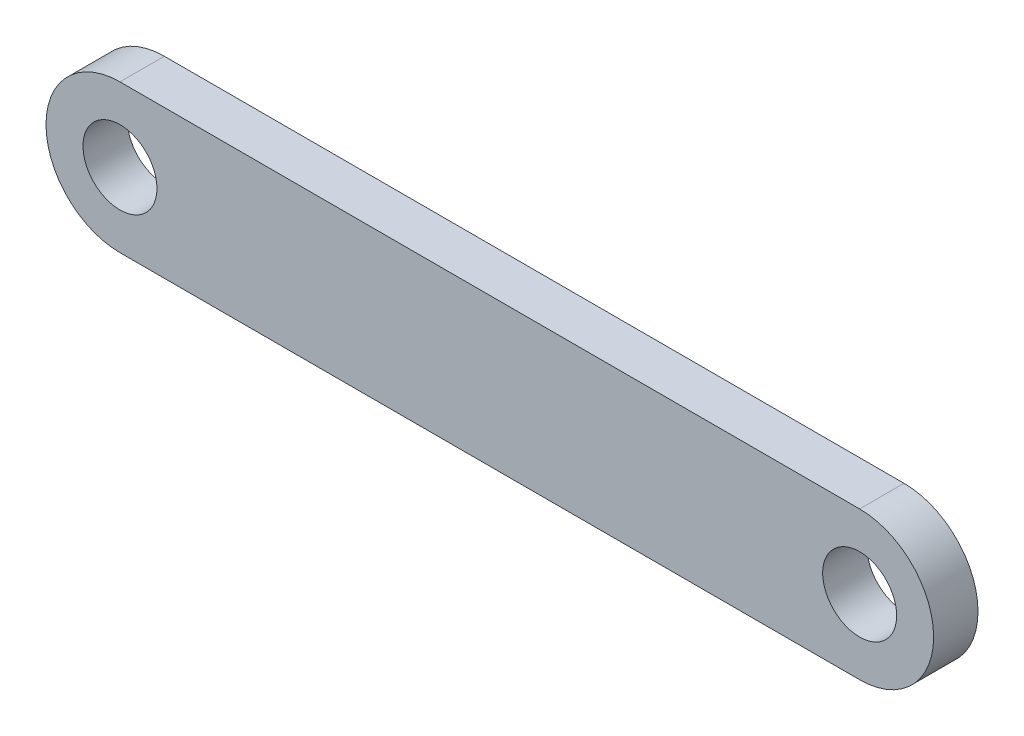
ISO-10303-21;
HEADER;
FILE_DESCRIPTION(('STEP AP214'),'2;1');
FILE_NAME('part.step','',(''),(''),'','','');
FILE_SCHEMA(('AUTOMOTIVE_DESIGN { 1 0 10303 214 1 1 1 1 }'));
ENDSEC;
DATA;
#1=APPLICATION_CONTEXT('core data for automotive mechanical design processes');
#2=APPLICATION_PROTOCOL_DEFINITION('international standard','automotive_design',2000,#1);
#3=PRODUCT_CONTEXT('',#1,'mechanical');
#4=PRODUCT('Part','Part','',(#3));
#5=PRODUCT_RELATED_PRODUCT_CATEGORY('part','',(#4));
#6=PRODUCT_DEFINITION_FORMATION('','',#4);
#7=PRODUCT_DEFINITION_CONTEXT('part definition',#1,'design');
#8=PRODUCT_DEFINITION('design','',#6,#7);
#9=PRODUCT_DEFINITION_SHAPE('','',#8);
#10=(LENGTH_UNIT() NAMED_UNIT(*) SI_UNIT(.MILLI.,.METRE.));
#11=(NAMED_UNIT(*) PLANE_ANGLE_UNIT() SI_UNIT($,.RADIAN.));
#12=(NAMED_UNIT(*) SI_UNIT($,.STERADIAN.) SOLID_ANGLE_UNIT());
#13=UNCERTAINTY_MEASURE_WITH_UNIT(LENGTH_MEASURE(1.E-05),#10,'distance_accuracy_value','');
#14=(GEOMETRIC_REPRESENTATION_CONTEXT(3) GLOBAL_UNCERTAINTY_ASSIGNED_CONTEXT((#13)) GLOBAL_UNIT_ASSIGNED_CONTEXT((#10,
#11,#12)) REPRESENTATION_CONTEXT('',''));
#15=CARTESIAN_POINT('',(0.,0.,0.));
#16=DIRECTION('',(0.,0.,1.));
#17=DIRECTION('',(1.,0.,0.));
#18=AXIS2_PLACEMENT_3D('',#15,#16,#17);
#19=CARTESIAN_POINT('',(-25.,0.,1.5));
#20=DIRECTION('',(0.,0.,-1.));
#21=DIRECTION('',(-1.,0.,0.));
#22=AXIS2_PLACEMENT_3D('',#19,#20,#21);
#23=CYLINDRICAL_SURFACE('',#22,5.);
#24=CARTESIAN_POINT('',(-25.,0.,-1.5));
#25=DIRECTION('',(0.,0.,1.));
#26=DIRECTION('',(1.,0.,0.));
#27=AXIS2_PLACEMENT_3D('',#24,#25,#26);
#28=CIRCLE('',#27,5.);
#29=CARTESIAN_POINT('',(-25.,5.,-1.5));
#30=VERTEX_POINT('',#29);
#31=CARTESIAN_POINT('',(-25.,-5.,-1.5));
#32=VERTEX_POINT('',#31);
#33=EDGE_CURVE('E108',#30,#32,#28,.T.);
#34=ORIENTED_EDGE('',*,*,#33,.T.);
#35=DIRECTION('',(0.,0.,-1.));
#36=VECTOR('',#35,1.);
#37=CARTESIAN_POINT('',(-25.,-5.,1.5));
#38=LINE('',#37,#36);
#39=CARTESIAN_POINT('',(-25.,-5.,1.5));
#40=VERTEX_POINT('',#39);
#41=EDGE_CURVE('E11',#40,#32,#38,.T.);
#42=ORIENTED_EDGE('',*,*,#41,.F.);
#43=CARTESIAN_POINT('',(-25.,0.,1.5));
#44=DIRECTION('',(0.,0.,1.));
#45=DIRECTION('',(1.,0.,0.));
#46=AXIS2_PLACEMENT_3D('',#43,#44,#45);
#47=CIRCLE('',#46,5.);
#48=CARTESIAN_POINT('',(-25.,5.,1.5));
#49=VERTEX_POINT('',#48);
#50=EDGE_CURVE('E96',#49,#40,#47,.T.);
#51=ORIENTED_EDGE('',*,*,#50,.F.);
#52=DIRECTION('',(0.,0.,-1.));
#53=VECTOR('',#52,1.);
#54=CARTESIAN_POINT('',(-25.,5.,1.5));
#55=LINE('',#54,#53);
#56=EDGE_CURVE('E101',#49,#30,#55,.T.);
#57=ORIENTED_EDGE('',*,*,#56,.T.);
#58=EDGE_LOOP('',(#34,#42,#51,#57));
#59=FACE_BOUND('',#58,.T.);
#60=ADVANCED_FACE('F44',(#59),#23,.T.);
#61=CARTESIAN_POINT('',(-25.,-5.,1.5));
#62=DIRECTION('',(0.,1.,0.));
#63=DIRECTION('',(-1.,0.,0.));
#64=AXIS2_PLACEMENT_3D('',#61,#62,#63);
#65=PLANE('',#64);
#66=DIRECTION('',(1.,0.,0.));
#67=VECTOR('',#66,1.);
#68=CARTESIAN_POINT('',(-25.,-5.,-1.5));
#69=LINE('',#68,#67);
#70=CARTESIAN_POINT('',(25.,-5.,-1.5));
#71=VERTEX_POINT('',#70);
#72=EDGE_CURVE('E99',#32,#71,#69,.T.);
#73=ORIENTED_EDGE('',*,*,#72,.T.);
#74=DIRECTION('',(0.,0.,-1.));
#75=VECTOR('',#74,1.);
#76=CARTESIAN_POINT('',(25.,-5.,1.5));
#77=LINE('',#76,#75);
#78=CARTESIAN_POINT('',(25.,-5.,1.5));
#79=VERTEX_POINT('',#78);
#80=EDGE_CURVE('E52',#79,#71,#77,.T.);
#81=ORIENTED_EDGE('',*,*,#80,.F.);
#82=DIRECTION('',(1.,0.,0.));
#83=VECTOR('',#82,1.);
#84=CARTESIAN_POINT('',(-25.,-5.,1.5));
#85=LINE('',#84,#83);
#86=EDGE_CURVE('E91',#40,#79,#85,.T.);
#87=ORIENTED_EDGE('',*,*,#86,.F.);
#88=ORIENTED_EDGE('',*,*,#41,.T.);
#89=EDGE_LOOP('',(#73,#81,#87,#88));
#90=FACE_BOUND('',#89,.T.);
#91=ADVANCED_FACE('F98',(#90),#65,.F.);
#92=CARTESIAN_POINT('',(25.,0.,1.5));
#93=DIRECTION('',(0.,0.,-1.));
#94=DIRECTION('',(-1.,0.,0.));
#95=AXIS2_PLACEMENT_3D('',#92,#93,#94);
#96=CYLINDRICAL_SURFACE('',#95,5.);
#97=CARTESIAN_POINT('',(25.,0.,-1.5));
#98=DIRECTION('',(0.,0.,1.));
#99=DIRECTION('',(1.,0.,0.));
#100=AXIS2_PLACEMENT_3D('',#97,#98,#99);
#101=CIRCLE('',#100,5.);
#102=CARTESIAN_POINT('',(25.,5.00000000000001,-1.5));
#103=VERTEX_POINT('',#102);
#104=EDGE_CURVE('E76',#71,#103,#101,.T.);
#105=ORIENTED_EDGE('',*,*,#104,.T.);
#106=DIRECTION('',(0.,0.,-1.));
#107=VECTOR('',#106,1.);
#108=CARTESIAN_POINT('',(25.,5.00000000000001,1.5));
#109=LINE('',#108,#107);
#110=CARTESIAN_POINT('',(25.,5.00000000000001,1.5));
#111=VERTEX_POINT('',#110);
#112=EDGE_CURVE('E102',#111,#103,#109,.T.);
#113=ORIENTED_EDGE('',*,*,#112,.F.);
#114=CARTESIAN_POINT('',(25.,0.,1.5));
#115=DIRECTION('',(0.,0.,1.));
#116=DIRECTION('',(1.,0.,0.));
#117=AXIS2_PLACEMENT_3D('',#114,#115,#116);
#118=CIRCLE('',#117,5.);
#119=EDGE_CURVE('E92',#79,#111,#118,.T.);
#120=ORIENTED_EDGE('',*,*,#119,.F.);
#121=ORIENTED_EDGE('',*,*,#80,.T.);
#122=EDGE_LOOP('',(#105,#113,#120,#121));
#123=FACE_BOUND('',#122,.T.);
#124=ADVANCED_FACE('F105',(#123),#96,.T.);
#125=CARTESIAN_POINT('',(-25.,5.,1.5));
#126=DIRECTION('',(0.,-1.,0.));
#127=DIRECTION('',(1.,0.,0.));
#128=AXIS2_PLACEMENT_3D('',#125,#126,#127);
#129=PLANE('',#128);
#130=DIRECTION('',(-1.,0.,0.));
#131=VECTOR('',#130,1.);
#132=CARTESIAN_POINT('',(-25.,5.,-1.5));
#133=LINE('',#132,#131);
#134=EDGE_CURVE('E84',#103,#30,#133,.T.);
#135=ORIENTED_EDGE('',*,*,#134,.T.);
#136=ORIENTED_EDGE('',*,*,#56,.F.);
#137=DIRECTION('',(-1.,0.,0.));
#138=VECTOR('',#137,1.);
#139=CARTESIAN_POINT('',(-25.,5.,1.5));
#140=LINE('',#139,#138);
#141=EDGE_CURVE('E62',#111,#49,#140,.T.);
#142=ORIENTED_EDGE('',*,*,#141,.F.);
#143=ORIENTED_EDGE('',*,*,#112,.T.);
#144=EDGE_LOOP('',(#135,#136,#142,#143));
#145=FACE_BOUND('',#144,.T.);
#146=ADVANCED_FACE('F117',(#145),#129,.F.);
#147=CARTESIAN_POINT('',(-25.,0.,1.5));
#148=DIRECTION('',(0.,0.,1.));
#149=DIRECTION('',(1.,0.,0.));
#150=AXIS2_PLACEMENT_3D('',#147,#148,#149);
#151=PLANE('',#150);
#152=CARTESIAN_POINT('',(-25.,0.,1.5));
#153=DIRECTION('',(0.,0.,1.));
#154=DIRECTION('',(1.,0.,0.));
#155=AXIS2_PLACEMENT_3D('',#152,#153,#154);
#156=CIRCLE('',#155,2.5);
#157=CARTESIAN_POINT('',(-22.5,0.,1.5));
#158=VERTEX_POINT('',#157);
#159=EDGE_CURVE('E126',#158,#158,#156,.T.);
#160=ORIENTED_EDGE('',*,*,#159,.F.);
#161=EDGE_LOOP('',(#160));
#162=FACE_BOUND('',#161,.T.);
#163=CARTESIAN_POINT('',(25.,0.,1.5));
#164=DIRECTION('',(0.,0.,1.));
#165=DIRECTION('',(1.,0.,0.));
#166=AXIS2_PLACEMENT_3D('',#163,#164,#165);
#167=CIRCLE('',#166,2.5);
#168=CARTESIAN_POINT('',(27.5,0.,1.5));
#169=VERTEX_POINT('',#168);
#170=EDGE_CURVE('E124',#169,#169,#167,.T.);
#171=ORIENTED_EDGE('',*,*,#170,.F.);
#172=EDGE_LOOP('',(#171));
#173=FACE_BOUND('',#172,.T.);
#174=ORIENTED_EDGE('',*,*,#50,.T.);
#175=ORIENTED_EDGE('',*,*,#86,.T.);
#176=ORIENTED_EDGE('',*,*,#119,.T.);
#177=ORIENTED_EDGE('',*,*,#141,.T.);
#178=EDGE_LOOP('',(#174,#175,#176,#177));
#179=FACE_BOUND('',#178,.T.);
#180=ADVANCED_FACE('F95',(#162,#173,#179),#151,.T.);
#181=CARTESIAN_POINT('',(-25.,0.,-1.5));
#182=DIRECTION('',(0.,0.,1.));
#183=DIRECTION('',(1.,0.,0.));
#184=AXIS2_PLACEMENT_3D('',#181,#182,#183);
#185=PLANE('',#184);
#186=CARTESIAN_POINT('',(-25.,0.,-1.5));
#187=DIRECTION('',(0.,0.,1.));
#188=DIRECTION('',(1.,0.,0.));
#189=AXIS2_PLACEMENT_3D('',#186,#187,#188);
#190=CIRCLE('',#189,2.5);
#191=CARTESIAN_POINT('',(-22.5,0.,-1.5));
#192=VERTEX_POINT('',#191);
#193=EDGE_CURVE('E112',#192,#192,#190,.T.);
#194=ORIENTED_EDGE('',*,*,#193,.T.);
#195=EDGE_LOOP('',(#194));
#196=FACE_BOUND('',#195,.T.);
#197=CARTESIAN_POINT('',(25.,0.,-1.5));
#198=DIRECTION('',(0.,0.,1.));
#199=DIRECTION('',(1.,0.,0.));
#200=AXIS2_PLACEMENT_3D('',#197,#198,#199);
#201=CIRCLE('',#200,2.5);
#202=CARTESIAN_POINT('',(27.5,0.,-1.5));
#203=VERTEX_POINT('',#202);
#204=EDGE_CURVE('E122',#203,#203,#201,.T.);
#205=ORIENTED_EDGE('',*,*,#204,.T.);
#206=EDGE_LOOP('',(#205));
#207=FACE_BOUND('',#206,.T.);
#208=ORIENTED_EDGE('',*,*,#33,.F.);
#209=ORIENTED_EDGE('',*,*,#134,.F.);
#210=ORIENTED_EDGE('',*,*,#104,.F.);
#211=ORIENTED_EDGE('',*,*,#72,.F.);
#212=EDGE_LOOP('',(#208,#209,#210,#211));
#213=FACE_BOUND('',#212,.T.);
#214=ADVANCED_FACE('F119',(#196,#207,#213),#185,.F.);
#215=CARTESIAN_POINT('',(25.,0.,-1.5));
#216=DIRECTION('',(0.,0.,1.));
#217=DIRECTION('',(1.,0.,0.));
#218=AXIS2_PLACEMENT_3D('',#215,#216,#217);
#219=CYLINDRICAL_SURFACE('',#218,2.5);
#220=ORIENTED_EDGE('',*,*,#204,.F.);
#221=EDGE_LOOP('',(#220));
#222=FACE_BOUND('',#221,.T.);
#223=ORIENTED_EDGE('',*,*,#170,.T.);
#224=EDGE_LOOP('',(#223));
#225=FACE_BOUND('',#224,.T.);
#226=ADVANCED_FACE('F137',(#222,#225),#219,.F.);
#227=CARTESIAN_POINT('',(-25.,0.,-1.5));
#228=DIRECTION('',(0.,0.,1.));
#229=DIRECTION('',(1.,0.,0.));
#230=AXIS2_PLACEMENT_3D('',#227,#228,#229);
#231=CYLINDRICAL_SURFACE('',#230,2.5);
#232=ORIENTED_EDGE('',*,*,#193,.F.);
#233=EDGE_LOOP('',(#232));
#234=FACE_BOUND('',#233,.T.);
#235=ORIENTED_EDGE('',*,*,#159,.T.);
#236=EDGE_LOOP('',(#235));
#237=FACE_BOUND('',#236,.T.);
#238=ADVANCED_FACE('F136',(#234,#237),#231,.F.);
#239=CLOSED_SHELL('',(#60,#91,#124,#146,#180,#214,#226,#238));
#240=MANIFOLD_SOLID_BREP('B2',#239);
#241=ADVANCED_BREP_SHAPE_REPRESENTATION('',(#18,#240),#14);
#242=SHAPE_DEFINITION_REPRESENTATION(#9,#241);
ENDSEC;
END-ISO-10303-21;
